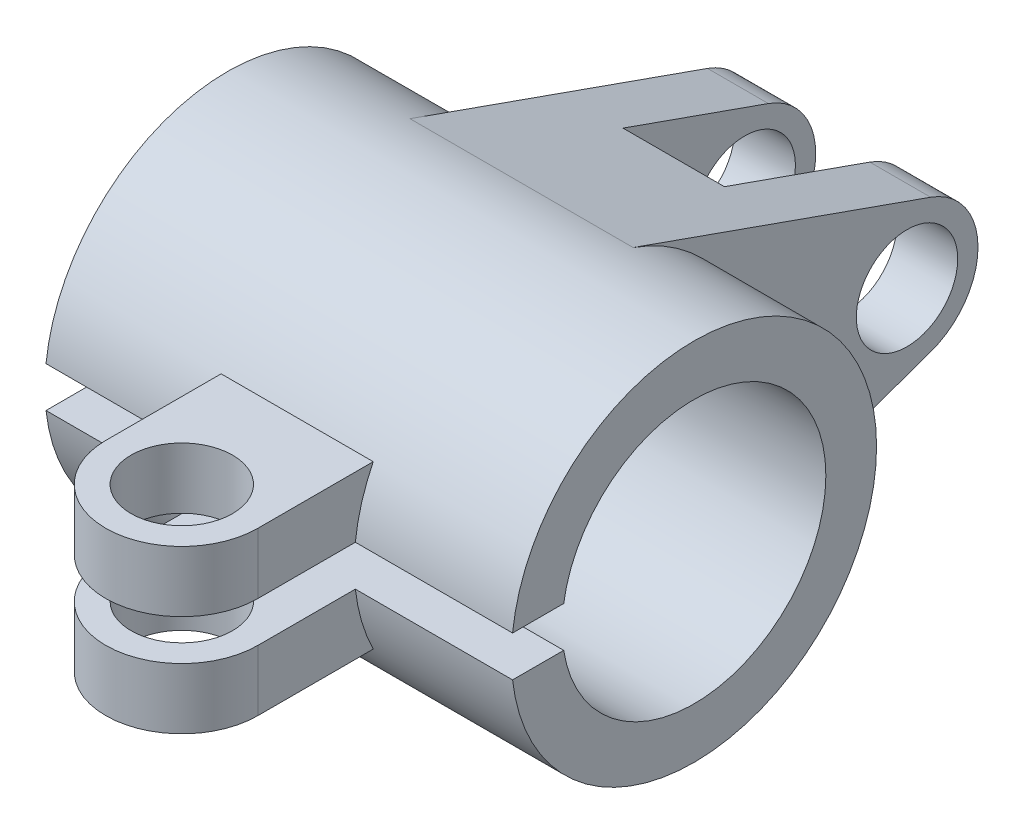
ISO-10303-21;
HEADER;
FILE_DESCRIPTION(('STEP AP214'),'2;1');
FILE_NAME('part.step','',(''),(''),'','','');
FILE_SCHEMA(('AUTOMOTIVE_DESIGN { 1 0 10303 214 1 1 1 1 }'));
ENDSEC;
DATA;
#1=APPLICATION_CONTEXT('core data for automotive mechanical design processes');
#2=APPLICATION_PROTOCOL_DEFINITION('international standard','automotive_design',2000,#1);
#3=PRODUCT_CONTEXT('',#1,'mechanical');
#4=PRODUCT('Part','Part','',(#3));
#5=PRODUCT_RELATED_PRODUCT_CATEGORY('part','',(#4));
#6=PRODUCT_DEFINITION_FORMATION('','',#4);
#7=PRODUCT_DEFINITION_CONTEXT('part definition',#1,'design');
#8=PRODUCT_DEFINITION('design','',#6,#7);
#9=PRODUCT_DEFINITION_SHAPE('','',#8);
#10=(LENGTH_UNIT() NAMED_UNIT(*) SI_UNIT(.MILLI.,.METRE.));
#11=(NAMED_UNIT(*) PLANE_ANGLE_UNIT() SI_UNIT($,.RADIAN.));
#12=(NAMED_UNIT(*) SI_UNIT($,.STERADIAN.) SOLID_ANGLE_UNIT());
#13=UNCERTAINTY_MEASURE_WITH_UNIT(LENGTH_MEASURE(1.E-05),#10,'distance_accuracy_value','');
#14=(GEOMETRIC_REPRESENTATION_CONTEXT(3) GLOBAL_UNCERTAINTY_ASSIGNED_CONTEXT((#13)) GLOBAL_UNIT_ASSIGNED_CONTEXT((#10,
#11,#12)) REPRESENTATION_CONTEXT('',''));
#15=CARTESIAN_POINT('',(0.,0.,0.));
#16=DIRECTION('',(0.,0.,1.));
#17=DIRECTION('',(1.,0.,0.));
#18=AXIS2_PLACEMENT_3D('',#15,#16,#17);
#19=CARTESIAN_POINT('',(0.,8.,27.5));
#20=DIRECTION('',(0.,-1.,0.));
#21=DIRECTION('',(0.,0.,-1.));
#22=AXIS2_PLACEMENT_3D('',#19,#20,#21);
#23=CYLINDRICAL_SURFACE('',#22,7.5);
#24=DIRECTION('',(0.,1.,0.));
#25=VECTOR('',#24,1.);
#26=CARTESIAN_POINT('',(7.5,8.,27.5));
#27=LINE('',#26,#25);
#28=CARTESIAN_POINT('',(7.5,8.,27.5));
#29=VERTEX_POINT('',#28);
#30=CARTESIAN_POINT('',(7.5,2.,27.5));
#31=VERTEX_POINT('',#30);
#32=EDGE_CURVE('E401',#29,#31,#27,.F.);
#33=ORIENTED_EDGE('',*,*,#32,.F.);
#34=CARTESIAN_POINT('',(0.,8.,27.5));
#35=DIRECTION('',(0.,1.,0.));
#36=DIRECTION('',(0.,0.,1.));
#37=AXIS2_PLACEMENT_3D('',#34,#35,#36);
#38=CIRCLE('',#37,7.5);
#39=CARTESIAN_POINT('',(-7.5,8.,27.5));
#40=VERTEX_POINT('',#39);
#41=EDGE_CURVE('E56',#40,#29,#38,.T.);
#42=ORIENTED_EDGE('',*,*,#41,.F.);
#43=DIRECTION('',(0.,-1.,0.));
#44=VECTOR('',#43,1.);
#45=CARTESIAN_POINT('',(-7.5,0.,27.5));
#46=LINE('',#45,#44);
#47=CARTESIAN_POINT('',(-7.5,2.,27.5));
#48=VERTEX_POINT('',#47);
#49=EDGE_CURVE('E404',#48,#40,#46,.F.);
#50=ORIENTED_EDGE('',*,*,#49,.F.);
#51=CARTESIAN_POINT('',(0.,2.,27.5));
#52=DIRECTION('',(0.,-1.,0.));
#53=DIRECTION('',(0.,0.,-1.));
#54=AXIS2_PLACEMENT_3D('',#51,#52,#53);
#55=CIRCLE('',#54,7.5);
#56=EDGE_CURVE('E11',#31,#48,#55,.T.);
#57=ORIENTED_EDGE('',*,*,#56,.F.);
#58=EDGE_LOOP('',(#33,#42,#50,#57));
#59=FACE_BOUND('',#58,.T.);
#60=ADVANCED_FACE('F47',(#59),#23,.T.);
#61=CARTESIAN_POINT('',(0.,-2.,27.5));
#62=DIRECTION('',(0.,-1.,0.));
#63=DIRECTION('',(0.,0.,-1.));
#64=AXIS2_PLACEMENT_3D('',#61,#62,#63);
#65=CYLINDRICAL_SURFACE('',#64,7.5);
#66=DIRECTION('',(0.,1.,0.));
#67=VECTOR('',#66,1.);
#68=CARTESIAN_POINT('',(7.5,-2.,27.5));
#69=LINE('',#68,#67);
#70=CARTESIAN_POINT('',(7.5,-2.,27.5));
#71=VERTEX_POINT('',#70);
#72=CARTESIAN_POINT('',(7.5,-8.,27.5));
#73=VERTEX_POINT('',#72);
#74=EDGE_CURVE('E387',#71,#73,#69,.F.);
#75=ORIENTED_EDGE('',*,*,#74,.F.);
#76=CARTESIAN_POINT('',(0.,-2.,27.5));
#77=DIRECTION('',(0.,-1.,0.));
#78=DIRECTION('',(0.,0.,-1.));
#79=AXIS2_PLACEMENT_3D('',#76,#77,#78);
#80=CIRCLE('',#79,7.5);
#81=CARTESIAN_POINT('',(-7.5,-2.,27.5));
#82=VERTEX_POINT('',#81);
#83=EDGE_CURVE('E395',#82,#71,#80,.F.);
#84=ORIENTED_EDGE('',*,*,#83,.F.);
#85=DIRECTION('',(0.,-1.,0.));
#86=VECTOR('',#85,1.);
#87=CARTESIAN_POINT('',(-7.5,0.,27.5));
#88=LINE('',#87,#86);
#89=CARTESIAN_POINT('',(-7.5,-8.,27.5));
#90=VERTEX_POINT('',#89);
#91=EDGE_CURVE('E391',#90,#82,#88,.F.);
#92=ORIENTED_EDGE('',*,*,#91,.F.);
#93=CARTESIAN_POINT('',(0.,-8.,27.5));
#94=DIRECTION('',(0.,1.,0.));
#95=DIRECTION('',(0.,0.,1.));
#96=AXIS2_PLACEMENT_3D('',#93,#94,#95);
#97=CIRCLE('',#96,7.5);
#98=EDGE_CURVE('E398',#73,#90,#97,.F.);
#99=ORIENTED_EDGE('',*,*,#98,.F.);
#100=EDGE_LOOP('',(#75,#84,#92,#99));
#101=FACE_BOUND('',#100,.T.);
#102=ADVANCED_FACE('F467',(#101),#65,.T.);
#103=CARTESIAN_POINT('',(11.,0.,-21.));
#104=DIRECTION('',(0.,0.,-1.));
#105=DIRECTION('',(-1.,0.,0.));
#106=AXIS2_PLACEMENT_3D('',#103,#104,#105);
#107=PLANE('',#106);
#108=DIRECTION('',(0.,-1.,0.));
#109=VECTOR('',#108,1.);
#110=CARTESIAN_POINT('',(-5.,0.,-21.));
#111=LINE('',#110,#109);
#112=CARTESIAN_POINT('',(-5.,11.667261889578,-21.));
#113=VERTEX_POINT('',#112);
#114=CARTESIAN_POINT('',(-5.,-11.667261889578,-21.));
#115=VERTEX_POINT('',#114);
#116=EDGE_CURVE('E246',#113,#115,#111,.T.);
#117=ORIENTED_EDGE('',*,*,#116,.F.);
#118=DIRECTION('',(-1.,0.,0.));
#119=VECTOR('',#118,1.);
#120=CARTESIAN_POINT('',(11.,11.667261889578,-21.));
#121=LINE('',#120,#119);
#122=CARTESIAN_POINT('',(5.,11.667261889578,-21.));
#123=VERTEX_POINT('',#122);
#124=EDGE_CURVE('E331',#123,#113,#121,.T.);
#125=ORIENTED_EDGE('',*,*,#124,.F.);
#126=DIRECTION('',(0.,-1.,0.));
#127=VECTOR('',#126,1.);
#128=CARTESIAN_POINT('',(5.,0.,-21.));
#129=LINE('',#128,#127);
#130=CARTESIAN_POINT('',(5.,-11.667261889578,-21.));
#131=VERTEX_POINT('',#130);
#132=EDGE_CURVE('E280',#123,#131,#129,.T.);
#133=ORIENTED_EDGE('',*,*,#132,.T.);
#134=DIRECTION('',(-1.,0.,0.));
#135=VECTOR('',#134,1.);
#136=CARTESIAN_POINT('',(11.,-11.667261889578,-21.));
#137=LINE('',#136,#135);
#138=EDGE_CURVE('E335',#131,#115,#137,.T.);
#139=ORIENTED_EDGE('',*,*,#138,.T.);
#140=EDGE_LOOP('',(#117,#125,#133,#139));
#141=FACE_BOUND('',#140,.T.);
#142=ADVANCED_FACE('F484',(#141),#107,.T.);
#143=CARTESIAN_POINT('',(23.,0.,0.));
#144=DIRECTION('',(-1.,0.,0.));
#145=DIRECTION('',(0.,0.,1.));
#146=AXIS2_PLACEMENT_3D('',#143,#144,#145);
#147=CYLINDRICAL_SURFACE('',#146,18.);
#148=DIRECTION('',(-1.,0.,0.));
#149=VECTOR('',#148,1.);
#150=CARTESIAN_POINT('',(11.,-16.9705627484771,-6.));
#151=LINE('',#150,#149);
#152=CARTESIAN_POINT('',(11.,-16.9705627484771,-6.));
#153=VERTEX_POINT('',#152);
#154=CARTESIAN_POINT('',(-11.,-16.9705627484771,-6.));
#155=VERTEX_POINT('',#154);
#156=EDGE_CURVE('E339',#153,#155,#151,.T.);
#157=ORIENTED_EDGE('',*,*,#156,.F.);
#158=CARTESIAN_POINT('',(11.,0.,0.));
#159=DIRECTION('',(1.,0.,0.));
#160=DIRECTION('',(0.,0.,-1.));
#161=AXIS2_PLACEMENT_3D('',#158,#159,#160);
#162=CIRCLE('',#161,18.);
#163=CARTESIAN_POINT('',(11.,16.9705627484771,-6.));
#164=VERTEX_POINT('',#163);
#165=EDGE_CURVE('E310',#153,#164,#162,.T.);
#166=ORIENTED_EDGE('',*,*,#165,.T.);
#167=DIRECTION('',(-1.,0.,0.));
#168=VECTOR('',#167,1.);
#169=CARTESIAN_POINT('',(11.,16.9705627484771,-6.));
#170=LINE('',#169,#168);
#171=CARTESIAN_POINT('',(-11.,16.9705627484771,-6.));
#172=VERTEX_POINT('',#171);
#173=EDGE_CURVE('E320',#164,#172,#170,.T.);
#174=ORIENTED_EDGE('',*,*,#173,.T.);
#175=CARTESIAN_POINT('',(-11.,0.,0.));
#176=DIRECTION('',(1.,0.,0.));
#177=DIRECTION('',(0.,0.,-1.));
#178=AXIS2_PLACEMENT_3D('',#175,#176,#177);
#179=CIRCLE('',#178,18.);
#180=EDGE_CURVE('E309',#155,#172,#179,.T.);
#181=ORIENTED_EDGE('',*,*,#180,.F.);
#182=EDGE_LOOP('',(#157,#166,#174,#181));
#183=FACE_BOUND('',#182,.T.);
#184=DIRECTION('',(-1.,0.,0.));
#185=VECTOR('',#184,1.);
#186=CARTESIAN_POINT('',(7.5,8.,16.1245154965971));
#187=LINE('',#186,#185);
#188=CARTESIAN_POINT('',(7.5,8.,16.1245154965971));
#189=VERTEX_POINT('',#188);
#190=CARTESIAN_POINT('',(-7.5,8.,16.1245154965971));
#191=VERTEX_POINT('',#190);
#192=EDGE_CURVE('E187',#189,#191,#187,.T.);
#193=ORIENTED_EDGE('',*,*,#192,.F.);
#194=CARTESIAN_POINT('',(7.5,0.,0.));
#195=DIRECTION('',(1.,0.,0.));
#196=DIRECTION('',(0.,0.,-1.));
#197=AXIS2_PLACEMENT_3D('',#194,#195,#196);
#198=CIRCLE('',#197,18.);
#199=CARTESIAN_POINT('',(7.5,2.,17.8885438199983));
#200=VERTEX_POINT('',#199);
#201=EDGE_CURVE('E193',#189,#200,#198,.T.);
#202=ORIENTED_EDGE('',*,*,#201,.T.);
#203=DIRECTION('',(-1.,0.,0.));
#204=VECTOR('',#203,1.);
#205=CARTESIAN_POINT('',(23.,2.,17.8885438199983));
#206=LINE('',#205,#204);
#207=CARTESIAN_POINT('',(23.,2.,17.8885438199983));
#208=VERTEX_POINT('',#207);
#209=EDGE_CURVE('E384',#208,#200,#206,.T.);
#210=ORIENTED_EDGE('',*,*,#209,.F.);
#211=CARTESIAN_POINT('',(23.,0.,0.));
#212=DIRECTION('',(1.,0.,0.));
#213=DIRECTION('',(0.,0.,-1.));
#214=AXIS2_PLACEMENT_3D('',#211,#212,#213);
#215=CIRCLE('',#214,18.);
#216=CARTESIAN_POINT('',(23.,-2.,17.8885438199983));
#217=VERTEX_POINT('',#216);
#218=EDGE_CURVE('E344',#217,#208,#215,.T.);
#219=ORIENTED_EDGE('',*,*,#218,.F.);
#220=DIRECTION('',(-1.,0.,0.));
#221=VECTOR('',#220,1.);
#222=CARTESIAN_POINT('',(23.,-2.,17.8885438199983));
#223=LINE('',#222,#221);
#224=CARTESIAN_POINT('',(7.5,-2.,17.8885438199983));
#225=VERTEX_POINT('',#224);
#226=EDGE_CURVE('E374',#217,#225,#223,.T.);
#227=ORIENTED_EDGE('',*,*,#226,.T.);
#228=CARTESIAN_POINT('',(7.5,0.,0.));
#229=DIRECTION('',(1.,0.,0.));
#230=DIRECTION('',(0.,0.,-1.));
#231=AXIS2_PLACEMENT_3D('',#228,#229,#230);
#232=CIRCLE('',#231,18.);
#233=CARTESIAN_POINT('',(7.5,-8.,16.1245154965971));
#234=VERTEX_POINT('',#233);
#235=EDGE_CURVE('E219',#225,#234,#232,.T.);
#236=ORIENTED_EDGE('',*,*,#235,.T.);
#237=DIRECTION('',(-1.,0.,0.));
#238=VECTOR('',#237,1.);
#239=CARTESIAN_POINT('',(7.5,-8.,16.1245154965971));
#240=LINE('',#239,#238);
#241=CARTESIAN_POINT('',(-7.5,-8.,16.1245154965971));
#242=VERTEX_POINT('',#241);
#243=EDGE_CURVE('E230',#234,#242,#240,.T.);
#244=ORIENTED_EDGE('',*,*,#243,.T.);
#245=CARTESIAN_POINT('',(-7.5,0.,0.));
#246=DIRECTION('',(1.,0.,0.));
#247=DIRECTION('',(0.,0.,-1.));
#248=AXIS2_PLACEMENT_3D('',#245,#246,#247);
#249=CIRCLE('',#248,18.);
#250=CARTESIAN_POINT('',(-7.5,-2.,17.8885438199983));
#251=VERTEX_POINT('',#250);
#252=EDGE_CURVE('E208',#251,#242,#249,.T.);
#253=ORIENTED_EDGE('',*,*,#252,.F.);
#254=CARTESIAN_POINT('',(-23.,-2.,17.8885438199983));
#255=VERTEX_POINT('',#254);
#256=EDGE_CURVE('E359',#251,#255,#223,.T.);
#257=ORIENTED_EDGE('',*,*,#256,.T.);
#258=CARTESIAN_POINT('',(-23.,0.,0.));
#259=DIRECTION('',(1.,0.,0.));
#260=DIRECTION('',(0.,0.,-1.));
#261=AXIS2_PLACEMENT_3D('',#258,#259,#260);
#262=CIRCLE('',#261,18.);
#263=CARTESIAN_POINT('',(-23.,2.,17.8885438199983));
#264=VERTEX_POINT('',#263);
#265=EDGE_CURVE('E343',#255,#264,#262,.T.);
#266=ORIENTED_EDGE('',*,*,#265,.T.);
#267=CARTESIAN_POINT('',(-7.5,2.,17.8885438199983));
#268=VERTEX_POINT('',#267);
#269=EDGE_CURVE('E383',#268,#264,#206,.T.);
#270=ORIENTED_EDGE('',*,*,#269,.F.);
#271=CARTESIAN_POINT('',(-7.5,0.,0.));
#272=DIRECTION('',(1.,0.,0.));
#273=DIRECTION('',(0.,0.,-1.));
#274=AXIS2_PLACEMENT_3D('',#271,#272,#273);
#275=CIRCLE('',#274,18.);
#276=EDGE_CURVE('E206',#191,#268,#275,.T.);
#277=ORIENTED_EDGE('',*,*,#276,.F.);
#278=EDGE_LOOP('',(#193,#202,#210,#219,#227,#236,#244,#253,#257,#266,#270,#277));
#279=FACE_BOUND('',#278,.T.);
#280=ADVANCED_FACE('F203',(#183,#279),#147,.T.);
#281=CARTESIAN_POINT('',(23.,2.,0.));
#282=DIRECTION('',(0.,-1.,0.));
#283=DIRECTION('',(0.,0.,-1.));
#284=AXIS2_PLACEMENT_3D('',#281,#282,#283);
#285=PLANE('',#284);
#286=CARTESIAN_POINT('',(0.,2.,27.5));
#287=DIRECTION('',(0.,-1.,0.));
#288=DIRECTION('',(0.,0.,-1.));
#289=AXIS2_PLACEMENT_3D('',#286,#287,#288);
#290=CIRCLE('',#289,5.);
#291=CARTESIAN_POINT('',(0.,2.,22.5));
#292=VERTEX_POINT('',#291);
#293=EDGE_CURVE('E428',#292,#292,#290,.T.);
#294=ORIENTED_EDGE('',*,*,#293,.F.);
#295=EDGE_LOOP('',(#294));
#296=FACE_BOUND('',#295,.T.);
#297=DIRECTION('',(0.,0.,1.));
#298=VECTOR('',#297,1.);
#299=CARTESIAN_POINT('',(7.5,2.,0.));
#300=LINE('',#299,#298);
#301=EDGE_CURVE('E192',#200,#31,#300,.T.);
#302=ORIENTED_EDGE('',*,*,#301,.T.);
#303=ORIENTED_EDGE('',*,*,#56,.T.);
#304=DIRECTION('',(0.,0.,1.));
#305=VECTOR('',#304,1.);
#306=CARTESIAN_POINT('',(-7.5,2.,0.));
#307=LINE('',#306,#305);
#308=EDGE_CURVE('E201',#268,#48,#307,.T.);
#309=ORIENTED_EDGE('',*,*,#308,.F.);
#310=ORIENTED_EDGE('',*,*,#269,.T.);
#311=DIRECTION('',(0.,0.,1.));
#312=VECTOR('',#311,1.);
#313=CARTESIAN_POINT('',(-23.,2.,0.));
#314=LINE('',#313,#312);
#315=CARTESIAN_POINT('',(-23.,2.,12.8452325786651));
#316=VERTEX_POINT('',#315);
#317=EDGE_CURVE('E363',#316,#264,#314,.T.);
#318=ORIENTED_EDGE('',*,*,#317,.F.);
#319=DIRECTION('',(-1.,0.,0.));
#320=VECTOR('',#319,1.);
#321=CARTESIAN_POINT('',(23.,2.,12.8452325786651));
#322=LINE('',#321,#320);
#323=CARTESIAN_POINT('',(23.,2.,12.8452325786651));
#324=VERTEX_POINT('',#323);
#325=EDGE_CURVE('E380',#324,#316,#322,.T.);
#326=ORIENTED_EDGE('',*,*,#325,.F.);
#327=DIRECTION('',(0.,0.,1.));
#328=VECTOR('',#327,1.);
#329=CARTESIAN_POINT('',(23.,2.,0.));
#330=LINE('',#329,#328);
#331=EDGE_CURVE('E347',#324,#208,#330,.T.);
#332=ORIENTED_EDGE('',*,*,#331,.T.);
#333=ORIENTED_EDGE('',*,*,#209,.T.);
#334=EDGE_LOOP('',(#302,#303,#309,#310,#318,#326,#332,#333));
#335=FACE_BOUND('',#334,.T.);
#336=ADVANCED_FACE('F420',(#296,#335),#285,.T.);
#337=CARTESIAN_POINT('',(23.,0.,0.));
#338=DIRECTION('',(-1.,0.,0.));
#339=DIRECTION('',(0.,0.,1.));
#340=AXIS2_PLACEMENT_3D('',#337,#338,#339);
#341=CYLINDRICAL_SURFACE('',#340,13.);
#342=CARTESIAN_POINT('',(-23.,0.,0.));
#343=DIRECTION('',(1.,0.,0.));
#344=DIRECTION('',(0.,0.,-1.));
#345=AXIS2_PLACEMENT_3D('',#342,#343,#344);
#346=CIRCLE('',#345,13.);
#347=CARTESIAN_POINT('',(-23.,-2.,12.8452325786651));
#348=VERTEX_POINT('',#347);
#349=EDGE_CURVE('E367',#348,#316,#346,.T.);
#350=ORIENTED_EDGE('',*,*,#349,.F.);
#351=DIRECTION('',(-1.,0.,0.));
#352=VECTOR('',#351,1.);
#353=CARTESIAN_POINT('',(23.,-2.,12.8452325786651));
#354=LINE('',#353,#352);
#355=CARTESIAN_POINT('',(23.,-2.,12.8452325786651));
#356=VERTEX_POINT('',#355);
#357=EDGE_CURVE('E377',#356,#348,#354,.T.);
#358=ORIENTED_EDGE('',*,*,#357,.F.);
#359=CARTESIAN_POINT('',(23.,0.,0.));
#360=DIRECTION('',(1.,0.,0.));
#361=DIRECTION('',(0.,0.,-1.));
#362=AXIS2_PLACEMENT_3D('',#359,#360,#361);
#363=CIRCLE('',#362,13.);
#364=EDGE_CURVE('E352',#356,#324,#363,.T.);
#365=ORIENTED_EDGE('',*,*,#364,.T.);
#366=ORIENTED_EDGE('',*,*,#325,.T.);
#367=EDGE_LOOP('',(#350,#358,#365,#366));
#368=FACE_BOUND('',#367,.T.);
#369=ADVANCED_FACE('F489',(#368),#341,.F.);
#370=CARTESIAN_POINT('',(23.,-2.,0.));
#371=DIRECTION('',(0.,-1.,0.));
#372=DIRECTION('',(0.,0.,-1.));
#373=AXIS2_PLACEMENT_3D('',#370,#371,#372);
#374=PLANE('',#373);
#375=CARTESIAN_POINT('',(0.,-2.,27.5));
#376=DIRECTION('',(0.,-1.,0.));
#377=DIRECTION('',(0.,0.,-1.));
#378=AXIS2_PLACEMENT_3D('',#375,#376,#377);
#379=CIRCLE('',#378,5.);
#380=CARTESIAN_POINT('',(0.,-2.,22.5));
#381=VERTEX_POINT('',#380);
#382=EDGE_CURVE('E439',#381,#381,#379,.T.);
#383=ORIENTED_EDGE('',*,*,#382,.T.);
#384=EDGE_LOOP('',(#383));
#385=FACE_BOUND('',#384,.T.);
#386=DIRECTION('',(0.,0.,1.));
#387=VECTOR('',#386,1.);
#388=CARTESIAN_POINT('',(-7.5,-2.,0.));
#389=LINE('',#388,#387);
#390=EDGE_CURVE('E213',#251,#82,#389,.T.);
#391=ORIENTED_EDGE('',*,*,#390,.T.);
#392=ORIENTED_EDGE('',*,*,#83,.T.);
#393=DIRECTION('',(0.,0.,1.));
#394=VECTOR('',#393,1.);
#395=CARTESIAN_POINT('',(7.5,-2.,0.));
#396=LINE('',#395,#394);
#397=EDGE_CURVE('E223',#225,#71,#396,.T.);
#398=ORIENTED_EDGE('',*,*,#397,.F.);
#399=ORIENTED_EDGE('',*,*,#226,.F.);
#400=DIRECTION('',(0.,0.,1.));
#401=VECTOR('',#400,1.);
#402=CARTESIAN_POINT('',(23.,-2.,0.));
#403=LINE('',#402,#401);
#404=EDGE_CURVE('E356',#356,#217,#403,.T.);
#405=ORIENTED_EDGE('',*,*,#404,.F.);
#406=ORIENTED_EDGE('',*,*,#357,.T.);
#407=DIRECTION('',(0.,0.,1.));
#408=VECTOR('',#407,1.);
#409=CARTESIAN_POINT('',(-23.,-2.,0.));
#410=LINE('',#409,#408);
#411=EDGE_CURVE('E348',#348,#255,#410,.T.);
#412=ORIENTED_EDGE('',*,*,#411,.T.);
#413=ORIENTED_EDGE('',*,*,#256,.F.);
#414=EDGE_LOOP('',(#391,#392,#398,#399,#405,#406,#412,#413));
#415=FACE_BOUND('',#414,.T.);
#416=ADVANCED_FACE('F414',(#385,#415),#374,.F.);
#417=CARTESIAN_POINT('',(23.,0.,0.));
#418=DIRECTION('',(1.,0.,0.));
#419=DIRECTION('',(0.,0.,-1.));
#420=AXIS2_PLACEMENT_3D('',#417,#418,#419);
#421=PLANE('',#420);
#422=ORIENTED_EDGE('',*,*,#218,.T.);
#423=ORIENTED_EDGE('',*,*,#331,.F.);
#424=ORIENTED_EDGE('',*,*,#364,.F.);
#425=ORIENTED_EDGE('',*,*,#404,.T.);
#426=EDGE_LOOP('',(#422,#423,#424,#425));
#427=FACE_BOUND('',#426,.T.);
#428=ADVANCED_FACE('F487',(#427),#421,.T.);
#429=CARTESIAN_POINT('',(-23.,0.,0.));
#430=DIRECTION('',(1.,0.,0.));
#431=DIRECTION('',(0.,0.,-1.));
#432=AXIS2_PLACEMENT_3D('',#429,#430,#431);
#433=PLANE('',#432);
#434=ORIENTED_EDGE('',*,*,#265,.F.);
#435=ORIENTED_EDGE('',*,*,#411,.F.);
#436=ORIENTED_EDGE('',*,*,#349,.T.);
#437=ORIENTED_EDGE('',*,*,#317,.T.);
#438=EDGE_LOOP('',(#434,#435,#436,#437));
#439=FACE_BOUND('',#438,.T.);
#440=ADVANCED_FACE('F418',(#439),#433,.F.);
#441=CARTESIAN_POINT('',(11.,-16.9705627484771,-6.));
#442=DIRECTION('',(0.,0.942809041582063,0.333333333333333));
#443=DIRECTION('',(0.,-0.333333333333333,0.942809041582063));
#444=AXIS2_PLACEMENT_3D('',#441,#442,#443);
#445=PLANE('',#444);
#446=DIRECTION('',(0.,0.333333333333333,-0.942809041582063));
#447=VECTOR('',#446,1.);
#448=CARTESIAN_POINT('',(-11.,-16.9705627484771,-6.));
#449=LINE('',#448,#447);
#450=CARTESIAN_POINT('',(-11.,-6.59966329107444,-35.3333333333333));
#451=VERTEX_POINT('',#450);
#452=EDGE_CURVE('E324',#155,#451,#449,.T.);
#453=ORIENTED_EDGE('',*,*,#452,.T.);
#454=DIRECTION('',(1.,0.,0.));
#455=VECTOR('',#454,1.);
#456=CARTESIAN_POINT('',(-11.,-6.59966329107444,-35.3333333333333));
#457=LINE('',#456,#455);
#458=CARTESIAN_POINT('',(-5.,-6.59966329107444,-35.3333333333333));
#459=VERTEX_POINT('',#458);
#460=EDGE_CURVE('E250',#451,#459,#457,.T.);
#461=ORIENTED_EDGE('',*,*,#460,.T.);
#462=DIRECTION('',(0.,0.333333333333333,-0.942809041582063));
#463=VECTOR('',#462,1.);
#464=CARTESIAN_POINT('',(-5.,-16.9705627484771,-6.));
#465=LINE('',#464,#463);
#466=EDGE_CURVE('E254',#115,#459,#465,.T.);
#467=ORIENTED_EDGE('',*,*,#466,.F.);
#468=ORIENTED_EDGE('',*,*,#138,.F.);
#469=DIRECTION('',(0.,0.333333333333333,-0.942809041582063));
#470=VECTOR('',#469,1.);
#471=CARTESIAN_POINT('',(5.,-16.9705627484771,-6.));
#472=LINE('',#471,#470);
#473=CARTESIAN_POINT('',(5.,-6.59966329107444,-35.3333333333333));
#474=VERTEX_POINT('',#473);
#475=EDGE_CURVE('E288',#131,#474,#472,.T.);
#476=ORIENTED_EDGE('',*,*,#475,.T.);
#477=DIRECTION('',(-1.,0.,0.));
#478=VECTOR('',#477,1.);
#479=CARTESIAN_POINT('',(11.,-6.59966329107444,-35.3333333333333));
#480=LINE('',#479,#478);
#481=CARTESIAN_POINT('',(11.,-6.59966329107444,-35.3333333333333));
#482=VERTEX_POINT('',#481);
#483=EDGE_CURVE('E305',#482,#474,#480,.T.);
#484=ORIENTED_EDGE('',*,*,#483,.F.);
#485=DIRECTION('',(0.,0.333333333333333,-0.942809041582063));
#486=VECTOR('',#485,1.);
#487=CARTESIAN_POINT('',(11.,-16.9705627484771,-6.));
#488=LINE('',#487,#486);
#489=EDGE_CURVE('E313',#153,#482,#488,.T.);
#490=ORIENTED_EDGE('',*,*,#489,.F.);
#491=ORIENTED_EDGE('',*,*,#156,.T.);
#492=EDGE_LOOP('',(#453,#461,#467,#468,#476,#484,#490,#491));
#493=FACE_BOUND('',#492,.T.);
#494=ADVANCED_FACE('F520',(#493),#445,.F.);
#495=CARTESIAN_POINT('',(11.,16.9705627484771,-6.));
#496=DIRECTION('',(0.,0.942809041582063,-0.333333333333333));
#497=DIRECTION('',(0.,0.333333333333333,0.942809041582063));
#498=AXIS2_PLACEMENT_3D('',#495,#496,#497);
#499=PLANE('',#498);
#500=DIRECTION('',(0.,-0.333333333333333,-0.942809041582063));
#501=VECTOR('',#500,1.);
#502=CARTESIAN_POINT('',(-11.,16.9705627484771,-6.));
#503=LINE('',#502,#501);
#504=CARTESIAN_POINT('',(-11.,6.59966329107444,-35.3333333333333));
#505=VERTEX_POINT('',#504);
#506=EDGE_CURVE('E314',#172,#505,#503,.T.);
#507=ORIENTED_EDGE('',*,*,#506,.F.);
#508=ORIENTED_EDGE('',*,*,#173,.F.);
#509=DIRECTION('',(0.,-0.333333333333333,-0.942809041582063));
#510=VECTOR('',#509,1.);
#511=CARTESIAN_POINT('',(11.,16.9705627484771,-6.));
#512=LINE('',#511,#510);
#513=CARTESIAN_POINT('',(11.,6.59966329107444,-35.3333333333333));
#514=VERTEX_POINT('',#513);
#515=EDGE_CURVE('E317',#164,#514,#512,.T.);
#516=ORIENTED_EDGE('',*,*,#515,.T.);
#517=DIRECTION('',(-1.,0.,0.));
#518=VECTOR('',#517,1.);
#519=CARTESIAN_POINT('',(11.,6.59966329107444,-35.3333333333333));
#520=LINE('',#519,#518);
#521=CARTESIAN_POINT('',(5.,6.59966329107444,-35.3333333333333));
#522=VERTEX_POINT('',#521);
#523=EDGE_CURVE('E284',#514,#522,#520,.T.);
#524=ORIENTED_EDGE('',*,*,#523,.T.);
#525=DIRECTION('',(0.,-0.333333333333333,-0.942809041582063));
#526=VECTOR('',#525,1.);
#527=CARTESIAN_POINT('',(5.,16.9705627484771,-6.));
#528=LINE('',#527,#526);
#529=EDGE_CURVE('E296',#123,#522,#528,.T.);
#530=ORIENTED_EDGE('',*,*,#529,.F.);
#531=ORIENTED_EDGE('',*,*,#124,.T.);
#532=DIRECTION('',(0.,-0.333333333333333,-0.942809041582063));
#533=VECTOR('',#532,1.);
#534=CARTESIAN_POINT('',(-5.,16.9705627484771,-6.));
#535=LINE('',#534,#533);
#536=CARTESIAN_POINT('',(-5.,6.59966329107444,-35.3333333333333));
#537=VERTEX_POINT('',#536);
#538=EDGE_CURVE('E262',#113,#537,#535,.T.);
#539=ORIENTED_EDGE('',*,*,#538,.T.);
#540=DIRECTION('',(1.,0.,0.));
#541=VECTOR('',#540,1.);
#542=CARTESIAN_POINT('',(-11.,6.59966329107444,-35.3333333333333));
#543=LINE('',#542,#541);
#544=EDGE_CURVE('E269',#505,#537,#543,.T.);
#545=ORIENTED_EDGE('',*,*,#544,.F.);
#546=EDGE_LOOP('',(#507,#508,#516,#524,#530,#531,#539,#545));
#547=FACE_BOUND('',#546,.T.);
#548=ADVANCED_FACE('F529',(#547),#499,.T.);
#549=CARTESIAN_POINT('',(11.,0.,0.));
#550=DIRECTION('',(1.,0.,0.));
#551=DIRECTION('',(0.,0.,-1.));
#552=AXIS2_PLACEMENT_3D('',#549,#550,#551);
#553=PLANE('',#552);
#554=ORIENTED_EDGE('',*,*,#165,.F.);
#555=ORIENTED_EDGE('',*,*,#489,.T.);
#556=CARTESIAN_POINT('',(11.,0.,-33.));
#557=DIRECTION('',(1.,0.,0.));
#558=DIRECTION('',(0.,0.,-1.));
#559=AXIS2_PLACEMENT_3D('',#556,#557,#558);
#560=CIRCLE('',#559,7.);
#561=EDGE_CURVE('E279',#482,#514,#560,.T.);
#562=ORIENTED_EDGE('',*,*,#561,.T.);
#563=ORIENTED_EDGE('',*,*,#515,.F.);
#564=EDGE_LOOP('',(#554,#555,#562,#563));
#565=FACE_BOUND('',#564,.T.);
#566=CARTESIAN_POINT('',(11.,0.,-33.));
#567=DIRECTION('',(1.,0.,0.));
#568=DIRECTION('',(0.,0.,-1.));
#569=AXIS2_PLACEMENT_3D('',#566,#567,#568);
#570=CIRCLE('',#569,5.);
#571=CARTESIAN_POINT('',(11.,0.,-38.));
#572=VERTEX_POINT('',#571);
#573=EDGE_CURVE('E275',#572,#572,#570,.T.);
#574=ORIENTED_EDGE('',*,*,#573,.F.);
#575=EDGE_LOOP('',(#574));
#576=FACE_BOUND('',#575,.T.);
#577=ADVANCED_FACE('F524',(#565,#576),#553,.T.);
#578=CARTESIAN_POINT('',(-11.,0.,0.));
#579=DIRECTION('',(1.,0.,0.));
#580=DIRECTION('',(0.,0.,-1.));
#581=AXIS2_PLACEMENT_3D('',#578,#579,#580);
#582=PLANE('',#581);
#583=ORIENTED_EDGE('',*,*,#180,.T.);
#584=ORIENTED_EDGE('',*,*,#506,.T.);
#585=CARTESIAN_POINT('',(-11.,0.,-33.));
#586=DIRECTION('',(1.,0.,0.));
#587=DIRECTION('',(0.,0.,-1.));
#588=AXIS2_PLACEMENT_3D('',#585,#586,#587);
#589=CIRCLE('',#588,7.);
#590=EDGE_CURVE('E245',#451,#505,#589,.T.);
#591=ORIENTED_EDGE('',*,*,#590,.F.);
#592=ORIENTED_EDGE('',*,*,#452,.F.);
#593=EDGE_LOOP('',(#583,#584,#591,#592));
#594=FACE_BOUND('',#593,.T.);
#595=CARTESIAN_POINT('',(-11.,0.,-33.));
#596=DIRECTION('',(1.,0.,0.));
#597=DIRECTION('',(0.,0.,-1.));
#598=AXIS2_PLACEMENT_3D('',#595,#596,#597);
#599=CIRCLE('',#598,5.);
#600=CARTESIAN_POINT('',(-11.,0.,-38.));
#601=VERTEX_POINT('',#600);
#602=EDGE_CURVE('E241',#601,#601,#599,.T.);
#603=ORIENTED_EDGE('',*,*,#602,.T.);
#604=EDGE_LOOP('',(#603));
#605=FACE_BOUND('',#604,.T.);
#606=ADVANCED_FACE('F533',(#594,#605),#582,.F.);
#607=CARTESIAN_POINT('',(11.,0.,-33.));
#608=DIRECTION('',(-1.,0.,0.));
#609=DIRECTION('',(0.,0.,1.));
#610=AXIS2_PLACEMENT_3D('',#607,#608,#609);
#611=CYLINDRICAL_SURFACE('',#610,7.);
#612=CARTESIAN_POINT('',(5.,0.,-33.));
#613=DIRECTION('',(1.,0.,0.));
#614=DIRECTION('',(0.,0.,-1.));
#615=AXIS2_PLACEMENT_3D('',#612,#613,#614);
#616=CIRCLE('',#615,7.);
#617=EDGE_CURVE('E292',#474,#522,#616,.T.);
#618=ORIENTED_EDGE('',*,*,#617,.T.);
#619=ORIENTED_EDGE('',*,*,#523,.F.);
#620=ORIENTED_EDGE('',*,*,#561,.F.);
#621=ORIENTED_EDGE('',*,*,#483,.T.);
#622=EDGE_LOOP('',(#618,#619,#620,#621));
#623=FACE_BOUND('',#622,.T.);
#624=ADVANCED_FACE('F547',(#623),#611,.T.);
#625=CARTESIAN_POINT('',(11.,0.,-33.));
#626=DIRECTION('',(-1.,0.,0.));
#627=DIRECTION('',(0.,0.,1.));
#628=AXIS2_PLACEMENT_3D('',#625,#626,#627);
#629=CYLINDRICAL_SURFACE('',#628,5.);
#630=ORIENTED_EDGE('',*,*,#573,.T.);
#631=EDGE_LOOP('',(#630));
#632=FACE_BOUND('',#631,.T.);
#633=CARTESIAN_POINT('',(5.,0.,-33.));
#634=DIRECTION('',(1.,0.,0.));
#635=DIRECTION('',(0.,0.,-1.));
#636=AXIS2_PLACEMENT_3D('',#633,#634,#635);
#637=CIRCLE('',#636,5.);
#638=CARTESIAN_POINT('',(5.,0.,-38.));
#639=VERTEX_POINT('',#638);
#640=EDGE_CURVE('E272',#639,#639,#637,.T.);
#641=ORIENTED_EDGE('',*,*,#640,.F.);
#642=EDGE_LOOP('',(#641));
#643=FACE_BOUND('',#642,.T.);
#644=ADVANCED_FACE('F549',(#632,#643),#629,.F.);
#645=CARTESIAN_POINT('',(5.,0.,0.));
#646=DIRECTION('',(1.,0.,0.));
#647=DIRECTION('',(0.,0.,-1.));
#648=AXIS2_PLACEMENT_3D('',#645,#646,#647);
#649=PLANE('',#648);
#650=ORIENTED_EDGE('',*,*,#640,.T.);
#651=EDGE_LOOP('',(#650));
#652=FACE_BOUND('',#651,.T.);
#653=ORIENTED_EDGE('',*,*,#475,.F.);
#654=ORIENTED_EDGE('',*,*,#132,.F.);
#655=ORIENTED_EDGE('',*,*,#529,.T.);
#656=ORIENTED_EDGE('',*,*,#617,.F.);
#657=EDGE_LOOP('',(#653,#654,#655,#656));
#658=FACE_BOUND('',#657,.T.);
#659=ADVANCED_FACE('F545',(#652,#658),#649,.F.);
#660=CARTESIAN_POINT('',(-11.,0.,-33.));
#661=DIRECTION('',(1.,0.,0.));
#662=DIRECTION('',(0.,0.,-1.));
#663=AXIS2_PLACEMENT_3D('',#660,#661,#662);
#664=CYLINDRICAL_SURFACE('',#663,5.);
#665=ORIENTED_EDGE('',*,*,#602,.F.);
#666=EDGE_LOOP('',(#665));
#667=FACE_BOUND('',#666,.T.);
#668=CARTESIAN_POINT('',(-5.,0.,-33.));
#669=DIRECTION('',(1.,0.,0.));
#670=DIRECTION('',(0.,0.,-1.));
#671=AXIS2_PLACEMENT_3D('',#668,#669,#670);
#672=CIRCLE('',#671,5.);
#673=CARTESIAN_POINT('',(-5.,0.,-38.));
#674=VERTEX_POINT('',#673);
#675=EDGE_CURVE('E240',#674,#674,#672,.T.);
#676=ORIENTED_EDGE('',*,*,#675,.T.);
#677=EDGE_LOOP('',(#676));
#678=FACE_BOUND('',#677,.T.);
#679=ADVANCED_FACE('F597',(#667,#678),#664,.F.);
#680=CARTESIAN_POINT('',(-11.,0.,-33.));
#681=DIRECTION('',(1.,0.,0.));
#682=DIRECTION('',(0.,0.,-1.));
#683=AXIS2_PLACEMENT_3D('',#680,#681,#682);
#684=CYLINDRICAL_SURFACE('',#683,7.);
#685=CARTESIAN_POINT('',(-5.,0.,-33.));
#686=DIRECTION('',(1.,0.,0.));
#687=DIRECTION('',(0.,0.,-1.));
#688=AXIS2_PLACEMENT_3D('',#685,#686,#687);
#689=CIRCLE('',#688,7.);
#690=EDGE_CURVE('E258',#459,#537,#689,.T.);
#691=ORIENTED_EDGE('',*,*,#690,.F.);
#692=ORIENTED_EDGE('',*,*,#460,.F.);
#693=ORIENTED_EDGE('',*,*,#590,.T.);
#694=ORIENTED_EDGE('',*,*,#544,.T.);
#695=EDGE_LOOP('',(#691,#692,#693,#694));
#696=FACE_BOUND('',#695,.T.);
#697=ADVANCED_FACE('F539',(#696),#684,.T.);
#698=CARTESIAN_POINT('',(-5.,0.,0.));
#699=DIRECTION('',(1.,0.,0.));
#700=DIRECTION('',(0.,0.,-1.));
#701=AXIS2_PLACEMENT_3D('',#698,#699,#700);
#702=PLANE('',#701);
#703=ORIENTED_EDGE('',*,*,#675,.F.);
#704=EDGE_LOOP('',(#703));
#705=FACE_BOUND('',#704,.T.);
#706=ORIENTED_EDGE('',*,*,#466,.T.);
#707=ORIENTED_EDGE('',*,*,#690,.T.);
#708=ORIENTED_EDGE('',*,*,#538,.F.);
#709=ORIENTED_EDGE('',*,*,#116,.T.);
#710=EDGE_LOOP('',(#706,#707,#708,#709));
#711=FACE_BOUND('',#710,.T.);
#712=ADVANCED_FACE('F455',(#705,#711),#702,.T.);
#713=CARTESIAN_POINT('',(7.5,-7.99999999999999,0.));
#714=DIRECTION('',(0.,1.,0.));
#715=DIRECTION('',(0.,0.,1.));
#716=AXIS2_PLACEMENT_3D('',#713,#714,#715);
#717=PLANE('',#716);
#718=CARTESIAN_POINT('',(0.,-8.,27.5));
#719=DIRECTION('',(0.,-1.,0.));
#720=DIRECTION('',(0.,0.,-1.));
#721=AXIS2_PLACEMENT_3D('',#718,#719,#720);
#722=CIRCLE('',#721,5.);
#723=CARTESIAN_POINT('',(0.,-8.,22.5));
#724=VERTEX_POINT('',#723);
#725=EDGE_CURVE('E443',#724,#724,#722,.T.);
#726=ORIENTED_EDGE('',*,*,#725,.F.);
#727=EDGE_LOOP('',(#726));
#728=FACE_BOUND('',#727,.T.);
#729=DIRECTION('',(0.,0.,-1.));
#730=VECTOR('',#729,1.);
#731=CARTESIAN_POINT('',(7.5,-7.99999999999999,0.));
#732=LINE('',#731,#730);
#733=EDGE_CURVE('E228',#73,#234,#732,.T.);
#734=ORIENTED_EDGE('',*,*,#733,.F.);
#735=ORIENTED_EDGE('',*,*,#98,.T.);
#736=DIRECTION('',(0.,0.,-1.));
#737=VECTOR('',#736,1.);
#738=CARTESIAN_POINT('',(-7.5,-7.99999999999999,0.));
#739=LINE('',#738,#737);
#740=EDGE_CURVE('E224',#90,#242,#739,.T.);
#741=ORIENTED_EDGE('',*,*,#740,.T.);
#742=ORIENTED_EDGE('',*,*,#243,.F.);
#743=EDGE_LOOP('',(#734,#735,#741,#742));
#744=FACE_BOUND('',#743,.T.);
#745=ADVANCED_FACE('F451',(#728,#744),#717,.F.);
#746=CARTESIAN_POINT('',(7.5,0.,0.));
#747=DIRECTION('',(1.,0.,0.));
#748=DIRECTION('',(0.,0.,-1.));
#749=AXIS2_PLACEMENT_3D('',#746,#747,#748);
#750=PLANE('',#749);
#751=ORIENTED_EDGE('',*,*,#397,.T.);
#752=ORIENTED_EDGE('',*,*,#74,.T.);
#753=ORIENTED_EDGE('',*,*,#733,.T.);
#754=ORIENTED_EDGE('',*,*,#235,.F.);
#755=EDGE_LOOP('',(#751,#752,#753,#754));
#756=FACE_BOUND('',#755,.T.);
#757=ADVANCED_FACE('F454',(#756),#750,.T.);
#758=CARTESIAN_POINT('',(-7.5,0.,0.));
#759=DIRECTION('',(1.,0.,0.));
#760=DIRECTION('',(0.,0.,-1.));
#761=AXIS2_PLACEMENT_3D('',#758,#759,#760);
#762=PLANE('',#761);
#763=ORIENTED_EDGE('',*,*,#740,.F.);
#764=ORIENTED_EDGE('',*,*,#91,.T.);
#765=ORIENTED_EDGE('',*,*,#390,.F.);
#766=ORIENTED_EDGE('',*,*,#252,.T.);
#767=EDGE_LOOP('',(#763,#764,#765,#766));
#768=FACE_BOUND('',#767,.T.);
#769=ADVANCED_FACE('F470',(#768),#762,.F.);
#770=CARTESIAN_POINT('',(7.5,7.99999999999999,0.));
#771=DIRECTION('',(0.,1.,0.));
#772=DIRECTION('',(0.,0.,1.));
#773=AXIS2_PLACEMENT_3D('',#770,#771,#772);
#774=PLANE('',#773);
#775=CARTESIAN_POINT('',(0.,8.,27.5));
#776=DIRECTION('',(0.,1.,0.));
#777=DIRECTION('',(0.,0.,1.));
#778=AXIS2_PLACEMENT_3D('',#775,#776,#777);
#779=CIRCLE('',#778,5.);
#780=CARTESIAN_POINT('',(0.,8.,32.5));
#781=VERTEX_POINT('',#780);
#782=EDGE_CURVE('E433',#781,#781,#779,.T.);
#783=ORIENTED_EDGE('',*,*,#782,.F.);
#784=EDGE_LOOP('',(#783));
#785=FACE_BOUND('',#784,.T.);
#786=DIRECTION('',(0.,0.,-1.));
#787=VECTOR('',#786,1.);
#788=CARTESIAN_POINT('',(-7.5,7.99999999999999,0.));
#789=LINE('',#788,#787);
#790=EDGE_CURVE('E425',#40,#191,#789,.T.);
#791=ORIENTED_EDGE('',*,*,#790,.F.);
#792=ORIENTED_EDGE('',*,*,#41,.T.);
#793=DIRECTION('',(0.,0.,-1.));
#794=VECTOR('',#793,1.);
#795=CARTESIAN_POINT('',(7.5,7.99999999999999,0.));
#796=LINE('',#795,#794);
#797=EDGE_CURVE('E182',#29,#189,#796,.T.);
#798=ORIENTED_EDGE('',*,*,#797,.T.);
#799=ORIENTED_EDGE('',*,*,#192,.T.);
#800=EDGE_LOOP('',(#791,#792,#798,#799));
#801=FACE_BOUND('',#800,.T.);
#802=ADVANCED_FACE('F185',(#785,#801),#774,.T.);
#803=CARTESIAN_POINT('',(7.5,0.,0.));
#804=DIRECTION('',(1.,0.,0.));
#805=DIRECTION('',(0.,0.,-1.));
#806=AXIS2_PLACEMENT_3D('',#803,#804,#805);
#807=PLANE('',#806);
#808=ORIENTED_EDGE('',*,*,#797,.F.);
#809=ORIENTED_EDGE('',*,*,#32,.T.);
#810=ORIENTED_EDGE('',*,*,#301,.F.);
#811=ORIENTED_EDGE('',*,*,#201,.F.);
#812=EDGE_LOOP('',(#808,#809,#810,#811));
#813=FACE_BOUND('',#812,.T.);
#814=ADVANCED_FACE('F196',(#813),#807,.T.);
#815=CARTESIAN_POINT('',(-7.5,0.,0.));
#816=DIRECTION('',(1.,0.,0.));
#817=DIRECTION('',(0.,0.,-1.));
#818=AXIS2_PLACEMENT_3D('',#815,#816,#817);
#819=PLANE('',#818);
#820=ORIENTED_EDGE('',*,*,#308,.T.);
#821=ORIENTED_EDGE('',*,*,#49,.T.);
#822=ORIENTED_EDGE('',*,*,#790,.T.);
#823=ORIENTED_EDGE('',*,*,#276,.T.);
#824=EDGE_LOOP('',(#820,#821,#822,#823));
#825=FACE_BOUND('',#824,.T.);
#826=ADVANCED_FACE('F426',(#825),#819,.F.);
#827=CARTESIAN_POINT('',(0.,-8.,27.5));
#828=DIRECTION('',(0.,-1.,0.));
#829=DIRECTION('',(0.,0.,-1.));
#830=AXIS2_PLACEMENT_3D('',#827,#828,#829);
#831=CYLINDRICAL_SURFACE('',#830,5.);
#832=ORIENTED_EDGE('',*,*,#725,.T.);
#833=EDGE_LOOP('',(#832));
#834=FACE_BOUND('',#833,.T.);
#835=ORIENTED_EDGE('',*,*,#382,.F.);
#836=EDGE_LOOP('',(#835));
#837=FACE_BOUND('',#836,.T.);
#838=ADVANCED_FACE('F448',(#834,#837),#831,.F.);
#839=ORIENTED_EDGE('',*,*,#293,.T.);
#840=EDGE_LOOP('',(#839));
#841=FACE_BOUND('',#840,.T.);
#842=ORIENTED_EDGE('',*,*,#782,.T.);
#843=EDGE_LOOP('',(#842));
#844=FACE_BOUND('',#843,.T.);
#845=ADVANCED_FACE('F703',(#841,#844),#831,.F.);
#846=CLOSED_SHELL('',(#60,#102,#142,#280,#336,#369,#416,#428,#440,#494,#548,#577,#606,#624,#644,
#659,#679,#697,#712,#745,#757,#769,#802,#814,#826,#838,#845));
#847=MANIFOLD_SOLID_BREP('B2',#846);
#848=ADVANCED_BREP_SHAPE_REPRESENTATION('',(#18,#847),#14);
#849=SHAPE_DEFINITION_REPRESENTATION(#9,#848);
ENDSEC;
END-ISO-10303-21;
